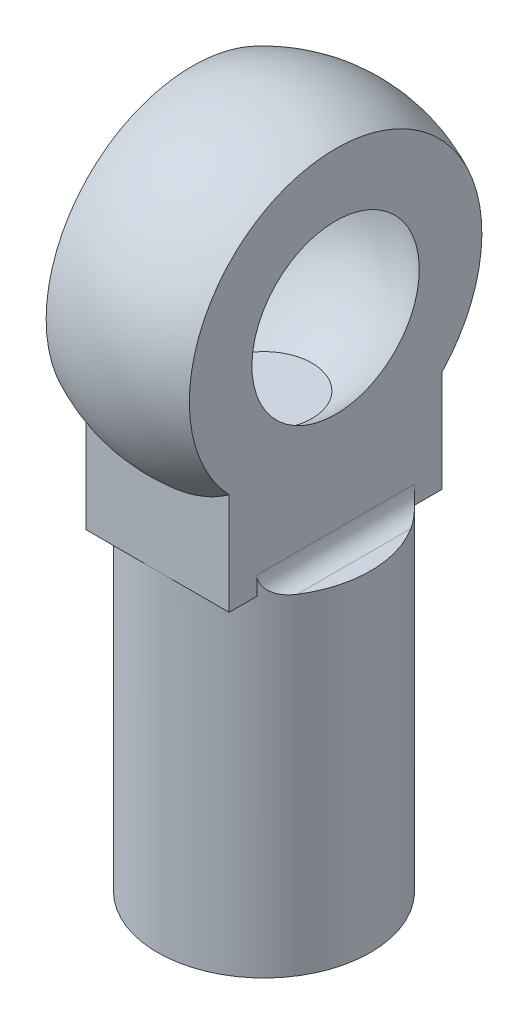
ISO-10303-21;
HEADER;
FILE_DESCRIPTION(('STEP AP214'),'2;1');
FILE_NAME('part.step','',(''),(''),'','','');
FILE_SCHEMA(('AUTOMOTIVE_DESIGN { 1 0 10303 214 1 1 1 1 }'));
ENDSEC;
DATA;
#1=APPLICATION_CONTEXT('core data for automotive mechanical design processes');
#2=APPLICATION_PROTOCOL_DEFINITION('international standard','automotive_design',2000,#1);
#3=PRODUCT_CONTEXT('',#1,'mechanical');
#4=PRODUCT('Part','Part','',(#3));
#5=PRODUCT_RELATED_PRODUCT_CATEGORY('part','',(#4));
#6=PRODUCT_DEFINITION_FORMATION('','',#4);
#7=PRODUCT_DEFINITION_CONTEXT('part definition',#1,'design');
#8=PRODUCT_DEFINITION('design','',#6,#7);
#9=PRODUCT_DEFINITION_SHAPE('','',#8);
#10=(LENGTH_UNIT() NAMED_UNIT(*) SI_UNIT(.MILLI.,.METRE.));
#11=(NAMED_UNIT(*) PLANE_ANGLE_UNIT() SI_UNIT($,.RADIAN.));
#12=(NAMED_UNIT(*) SI_UNIT($,.STERADIAN.) SOLID_ANGLE_UNIT());
#13=UNCERTAINTY_MEASURE_WITH_UNIT(LENGTH_MEASURE(1.E-05),#10,'distance_accuracy_value','');
#14=(GEOMETRIC_REPRESENTATION_CONTEXT(3) GLOBAL_UNCERTAINTY_ASSIGNED_CONTEXT((#13)) GLOBAL_UNIT_ASSIGNED_CONTEXT((#10,
#11,#12)) REPRESENTATION_CONTEXT('',''));
#15=CARTESIAN_POINT('',(0.,0.,0.));
#16=DIRECTION('',(0.,0.,1.));
#17=DIRECTION('',(1.,0.,0.));
#18=AXIS2_PLACEMENT_3D('',#15,#16,#17);
#19=CARTESIAN_POINT('',(-8.39049687524185,-5.5,-2.9));
#20=DIRECTION('',(0.,1.,0.));
#21=DIRECTION('',(-1.,0.,0.));
#22=AXIS2_PLACEMENT_3D('',#19,#20,#21);
#23=PLANE('',#22);
#24=CARTESIAN_POINT('',(0.,-5.5,0.));
#25=DIRECTION('',(0.,-1.,0.));
#26=DIRECTION('',(1.,0.,0.));
#27=AXIS2_PLACEMENT_3D('',#24,#25,#26);
#28=CIRCLE('',#27,2.9);
#29=CARTESIAN_POINT('',(1.95,-5.5,2.14650879336657));
#30=VERTEX_POINT('',#29);
#31=CARTESIAN_POINT('',(0.,-5.5,2.9));
#32=VERTEX_POINT('',#31);
#33=EDGE_CURVE('E148',#30,#32,#28,.T.);
#34=ORIENTED_EDGE('',*,*,#33,.F.);
#35=DIRECTION('',(0.,0.,-1.));
#36=VECTOR('',#35,1.);
#37=CARTESIAN_POINT('',(1.95,-5.5,-2.9));
#38=LINE('',#37,#36);
#39=CARTESIAN_POINT('',(1.95,-5.5,2.9));
#40=VERTEX_POINT('',#39);
#41=EDGE_CURVE('E140',#40,#30,#38,.T.);
#42=ORIENTED_EDGE('',*,*,#41,.F.);
#43=DIRECTION('',(1.,0.,0.));
#44=VECTOR('',#43,1.);
#45=CARTESIAN_POINT('',(-8.39049687524185,-5.5,2.9));
#46=LINE('',#45,#44);
#47=EDGE_CURVE('E306',#32,#40,#46,.T.);
#48=ORIENTED_EDGE('',*,*,#47,.F.);
#49=EDGE_LOOP('',(#34,#42,#48));
#50=FACE_BOUND('',#49,.T.);
#51=ADVANCED_FACE('F35',(#50),#23,.F.);
#52=CARTESIAN_POINT('',(-1.95,-5.5,2.14650879336657));
#53=VERTEX_POINT('',#52);
#54=EDGE_CURVE('E149',#32,#53,#28,.T.);
#55=ORIENTED_EDGE('',*,*,#54,.F.);
#56=CARTESIAN_POINT('',(-1.95,-5.5,2.9));
#57=VERTEX_POINT('',#56);
#58=EDGE_CURVE('E229',#57,#32,#46,.T.);
#59=ORIENTED_EDGE('',*,*,#58,.F.);
#60=DIRECTION('',(0.,0.,-1.));
#61=VECTOR('',#60,1.);
#62=CARTESIAN_POINT('',(-1.95,-5.5,-2.9));
#63=LINE('',#62,#61);
#64=EDGE_CURVE('E315',#57,#53,#63,.T.);
#65=ORIENTED_EDGE('',*,*,#64,.T.);
#66=EDGE_LOOP('',(#55,#59,#65));
#67=FACE_BOUND('',#66,.T.);
#68=ADVANCED_FACE('F194',(#67),#23,.F.);
#69=CARTESIAN_POINT('',(-1.95,-5.5,-2.14650879336657));
#70=VERTEX_POINT('',#69);
#71=CARTESIAN_POINT('',(0.,-5.5,-2.9));
#72=VERTEX_POINT('',#71);
#73=EDGE_CURVE('E145',#70,#72,#28,.T.);
#74=ORIENTED_EDGE('',*,*,#73,.F.);
#75=CARTESIAN_POINT('',(-1.95,-5.5,-2.9));
#76=VERTEX_POINT('',#75);
#77=EDGE_CURVE('E221',#70,#76,#63,.T.);
#78=ORIENTED_EDGE('',*,*,#77,.T.);
#79=DIRECTION('',(1.,0.,0.));
#80=VECTOR('',#79,1.);
#81=CARTESIAN_POINT('',(-8.39049687524185,-5.5,-2.9));
#82=LINE('',#81,#80);
#83=EDGE_CURVE('E224',#76,#72,#82,.T.);
#84=ORIENTED_EDGE('',*,*,#83,.T.);
#85=EDGE_LOOP('',(#74,#78,#84));
#86=FACE_BOUND('',#85,.T.);
#87=ADVANCED_FACE('F200',(#86),#23,.F.);
#88=CARTESIAN_POINT('',(0.,0.,0.));
#89=DIRECTION('',(0.,1.,0.));
#90=DIRECTION('',(1.,0.,0.));
#91=AXIS2_PLACEMENT_3D('',#88,#89,#90);
#92=SPHERICAL_SURFACE('',#91,4.435);
#93=CARTESIAN_POINT('',(0.,0.,2.9));
#94=DIRECTION('',(0.,0.,-1.));
#95=DIRECTION('',(0.,1.,0.));
#96=AXIS2_PLACEMENT_3D('',#93,#94,#95);
#97=CIRCLE('',#96,3.3554768662591);
#98=CARTESIAN_POINT('',(1.95,-2.73070045958908,2.9));
#99=VERTEX_POINT('',#98);
#100=CARTESIAN_POINT('',(-1.95,-2.73070045958908,2.9));
#101=VERTEX_POINT('',#100);
#102=EDGE_CURVE('E235',#99,#101,#97,.T.);
#103=ORIENTED_EDGE('',*,*,#102,.F.);
#104=CARTESIAN_POINT('',(1.95,0.,0.));
#105=DIRECTION('',(-1.,0.,0.));
#106=DIRECTION('',(0.,-1.,0.));
#107=AXIS2_PLACEMENT_3D('',#104,#105,#106);
#108=CIRCLE('',#107,3.98330578791034);
#109=CARTESIAN_POINT('',(1.95,-2.73070045958908,-2.9));
#110=VERTEX_POINT('',#109);
#111=EDGE_CURVE('E243',#99,#110,#108,.T.);
#112=ORIENTED_EDGE('',*,*,#111,.T.);
#113=CARTESIAN_POINT('',(0.,0.,-2.9));
#114=DIRECTION('',(0.,0.,1.));
#115=DIRECTION('',(0.,-1.,0.));
#116=AXIS2_PLACEMENT_3D('',#113,#114,#115);
#117=CIRCLE('',#116,3.3554768662591);
#118=CARTESIAN_POINT('',(-1.95,-2.73070045958908,-2.9));
#119=VERTEX_POINT('',#118);
#120=EDGE_CURVE('E233',#119,#110,#117,.T.);
#121=ORIENTED_EDGE('',*,*,#120,.F.);
#122=CARTESIAN_POINT('',(-1.95,0.,0.));
#123=DIRECTION('',(1.,0.,0.));
#124=DIRECTION('',(0.,1.,0.));
#125=AXIS2_PLACEMENT_3D('',#122,#123,#124);
#126=CIRCLE('',#125,3.98330578791034);
#127=EDGE_CURVE('E151',#119,#101,#126,.T.);
#128=ORIENTED_EDGE('',*,*,#127,.T.);
#129=EDGE_LOOP('',(#103,#112,#121,#128));
#130=FACE_BOUND('',#129,.T.);
#131=ADVANCED_FACE('F212',(#130),#92,.T.);
#132=CARTESIAN_POINT('',(0.,0.,0.));
#133=DIRECTION('',(0.,1.,0.));
#134=DIRECTION('',(0.,0.,1.));
#135=AXIS2_PLACEMENT_3D('',#132,#133,#134);
#136=SPHERICAL_SURFACE('',#135,3.);
#137=CARTESIAN_POINT('',(0.,-2.7,0.));
#138=DIRECTION('',(0.,-1.,0.));
#139=DIRECTION('',(1.,0.,0.));
#140=AXIS2_PLACEMENT_3D('',#137,#138,#139);
#141=CIRCLE('',#140,1.3076696830622);
#142=CARTESIAN_POINT('',(1.3076696830622,-2.7,0.));
#143=VERTEX_POINT('',#142);
#144=EDGE_CURVE('E146',#143,#143,#141,.T.);
#145=ORIENTED_EDGE('',*,*,#144,.T.);
#146=EDGE_LOOP('',(#145));
#147=FACE_BOUND('',#146,.T.);
#148=CARTESIAN_POINT('',(-1.95,0.,0.));
#149=DIRECTION('',(1.,0.,0.));
#150=DIRECTION('',(0.,1.,0.));
#151=AXIS2_PLACEMENT_3D('',#148,#149,#150);
#152=CIRCLE('',#151,2.2798026230356);
#153=CARTESIAN_POINT('',(-1.95,2.2798026230356,0.));
#154=VERTEX_POINT('',#153);
#155=EDGE_CURVE('E239',#154,#154,#152,.F.);
#156=ORIENTED_EDGE('',*,*,#155,.T.);
#157=EDGE_LOOP('',(#156));
#158=FACE_BOUND('',#157,.T.);
#159=CARTESIAN_POINT('',(1.95,0.,0.));
#160=DIRECTION('',(-1.,0.,0.));
#161=DIRECTION('',(0.,-1.,0.));
#162=AXIS2_PLACEMENT_3D('',#159,#160,#161);
#163=CIRCLE('',#162,2.2798026230356);
#164=CARTESIAN_POINT('',(1.95,-2.2798026230356,0.));
#165=VERTEX_POINT('',#164);
#166=EDGE_CURVE('E240',#165,#165,#163,.F.);
#167=ORIENTED_EDGE('',*,*,#166,.T.);
#168=EDGE_LOOP('',(#167));
#169=FACE_BOUND('',#168,.T.);
#170=ADVANCED_FACE('F217',(#147,#158,#169),#136,.F.);
#171=CARTESIAN_POINT('',(1.95,4.93146209986908,-10.));
#172=DIRECTION('',(-1.,0.,0.));
#173=DIRECTION('',(0.,-1.,0.));
#174=AXIS2_PLACEMENT_3D('',#171,#172,#173);
#175=PLANE('',#174);
#176=ORIENTED_EDGE('',*,*,#166,.F.);
#177=EDGE_LOOP('',(#176));
#178=FACE_BOUND('',#177,.T.);
#179=DIRECTION('',(0.,0.,-1.));
#180=VECTOR('',#179,1.);
#181=CARTESIAN_POINT('',(1.95,-5.,-2.14650879336657));
#182=LINE('',#181,#180);
#183=CARTESIAN_POINT('',(1.95,-5.,2.14650879336657));
#184=VERTEX_POINT('',#183);
#185=CARTESIAN_POINT('',(1.95,-5.,-2.14650879336657));
#186=VERTEX_POINT('',#185);
#187=EDGE_CURVE('E130',#184,#186,#182,.T.);
#188=ORIENTED_EDGE('',*,*,#187,.T.);
#189=DIRECTION('',(0.,1.,0.));
#190=VECTOR('',#189,1.);
#191=CARTESIAN_POINT('',(1.95,-5.,-2.14650879336657));
#192=LINE('',#191,#190);
#193=CARTESIAN_POINT('',(1.95,-5.5,-2.14650879336657));
#194=VERTEX_POINT('',#193);
#195=EDGE_CURVE('E123',#186,#194,#192,.F.);
#196=ORIENTED_EDGE('',*,*,#195,.T.);
#197=CARTESIAN_POINT('',(1.95,-5.5,-2.9));
#198=VERTEX_POINT('',#197);
#199=EDGE_CURVE('E127',#194,#198,#38,.T.);
#200=ORIENTED_EDGE('',*,*,#199,.T.);
#201=DIRECTION('',(0.,1.,0.));
#202=VECTOR('',#201,1.);
#203=CARTESIAN_POINT('',(1.95,-2.7,-2.9));
#204=LINE('',#203,#202);
#205=EDGE_CURVE('E160',#198,#110,#204,.T.);
#206=ORIENTED_EDGE('',*,*,#205,.T.);
#207=ORIENTED_EDGE('',*,*,#111,.F.);
#208=DIRECTION('',(0.,-1.,0.));
#209=VECTOR('',#208,1.);
#210=CARTESIAN_POINT('',(1.95,-2.7,2.9));
#211=LINE('',#210,#209);
#212=EDGE_CURVE('E141',#99,#40,#211,.T.);
#213=ORIENTED_EDGE('',*,*,#212,.T.);
#214=ORIENTED_EDGE('',*,*,#41,.T.);
#215=DIRECTION('',(0.,1.,0.));
#216=VECTOR('',#215,1.);
#217=CARTESIAN_POINT('',(1.95,-5.5,2.14650879336657));
#218=LINE('',#217,#216);
#219=EDGE_CURVE('E54',#30,#184,#218,.T.);
#220=ORIENTED_EDGE('',*,*,#219,.T.);
#221=EDGE_LOOP('',(#188,#196,#200,#206,#207,#213,#214,#220));
#222=FACE_BOUND('',#221,.T.);
#223=ADVANCED_FACE('F125',(#178,#222),#175,.F.);
#224=CARTESIAN_POINT('',(-1.95,4.93146209986908,-10.));
#225=DIRECTION('',(1.,0.,0.));
#226=DIRECTION('',(0.,1.,0.));
#227=AXIS2_PLACEMENT_3D('',#224,#225,#226);
#228=PLANE('',#227);
#229=ORIENTED_EDGE('',*,*,#77,.F.);
#230=DIRECTION('',(0.,1.,0.));
#231=VECTOR('',#230,1.);
#232=CARTESIAN_POINT('',(-1.95,-5.5,-2.14650879336657));
#233=LINE('',#232,#231);
#234=CARTESIAN_POINT('',(-1.95,-5.,-2.14650879336657));
#235=VERTEX_POINT('',#234);
#236=EDGE_CURVE('E61',#70,#235,#233,.T.);
#237=ORIENTED_EDGE('',*,*,#236,.T.);
#238=DIRECTION('',(0.,0.,-1.));
#239=VECTOR('',#238,1.);
#240=CARTESIAN_POINT('',(-1.95,-5.,2.14650879336657));
#241=LINE('',#240,#239);
#242=CARTESIAN_POINT('',(-1.95,-5.,2.14650879336657));
#243=VERTEX_POINT('',#242);
#244=EDGE_CURVE('E254',#235,#243,#241,.F.);
#245=ORIENTED_EDGE('',*,*,#244,.T.);
#246=DIRECTION('',(0.,1.,0.));
#247=VECTOR('',#246,1.);
#248=CARTESIAN_POINT('',(-1.95,-5.,2.14650879336657));
#249=LINE('',#248,#247);
#250=EDGE_CURVE('E252',#243,#53,#249,.F.);
#251=ORIENTED_EDGE('',*,*,#250,.T.);
#252=ORIENTED_EDGE('',*,*,#64,.F.);
#253=DIRECTION('',(0.,-1.,0.));
#254=VECTOR('',#253,1.);
#255=CARTESIAN_POINT('',(-1.95,-2.7,2.9));
#256=LINE('',#255,#254);
#257=EDGE_CURVE('E226',#101,#57,#256,.T.);
#258=ORIENTED_EDGE('',*,*,#257,.F.);
#259=ORIENTED_EDGE('',*,*,#127,.F.);
#260=DIRECTION('',(0.,1.,0.));
#261=VECTOR('',#260,1.);
#262=CARTESIAN_POINT('',(-1.95,-2.7,-2.9));
#263=LINE('',#262,#261);
#264=EDGE_CURVE('E236',#76,#119,#263,.T.);
#265=ORIENTED_EDGE('',*,*,#264,.F.);
#266=EDGE_LOOP('',(#229,#237,#245,#251,#252,#258,#259,#265));
#267=FACE_BOUND('',#266,.T.);
#268=ORIENTED_EDGE('',*,*,#155,.F.);
#269=EDGE_LOOP('',(#268));
#270=FACE_BOUND('',#269,.T.);
#271=ADVANCED_FACE('F278',(#267,#270),#228,.F.);
#272=CARTESIAN_POINT('',(-8.39049687524185,-2.7,-2.9));
#273=DIRECTION('',(0.,-1.,0.));
#274=DIRECTION('',(1.,0.,0.));
#275=AXIS2_PLACEMENT_3D('',#272,#273,#274);
#276=PLANE('',#275);
#277=ORIENTED_EDGE('',*,*,#144,.F.);
#278=EDGE_LOOP('',(#277));
#279=FACE_BOUND('',#278,.T.);
#280=ADVANCED_FACE('F282',(#279),#276,.F.);
#281=CARTESIAN_POINT('',(-8.39049687524185,-2.7,2.9));
#282=DIRECTION('',(0.,0.,-1.));
#283=DIRECTION('',(0.,1.,0.));
#284=AXIS2_PLACEMENT_3D('',#281,#282,#283);
#285=PLANE('',#284);
#286=ORIENTED_EDGE('',*,*,#58,.T.);
#287=ORIENTED_EDGE('',*,*,#47,.T.);
#288=ORIENTED_EDGE('',*,*,#212,.F.);
#289=ORIENTED_EDGE('',*,*,#102,.T.);
#290=ORIENTED_EDGE('',*,*,#257,.T.);
#291=EDGE_LOOP('',(#286,#287,#288,#289,#290));
#292=FACE_BOUND('',#291,.T.);
#293=ADVANCED_FACE('F209',(#292),#285,.F.);
#294=CARTESIAN_POINT('',(-8.39049687524185,-2.7,-2.9));
#295=DIRECTION('',(0.,0.,1.));
#296=DIRECTION('',(0.,-1.,0.));
#297=AXIS2_PLACEMENT_3D('',#294,#295,#296);
#298=PLANE('',#297);
#299=ORIENTED_EDGE('',*,*,#264,.T.);
#300=ORIENTED_EDGE('',*,*,#120,.T.);
#301=ORIENTED_EDGE('',*,*,#205,.F.);
#302=EDGE_CURVE('E138',#72,#198,#82,.T.);
#303=ORIENTED_EDGE('',*,*,#302,.F.);
#304=ORIENTED_EDGE('',*,*,#83,.F.);
#305=EDGE_LOOP('',(#299,#300,#301,#303,#304));
#306=FACE_BOUND('',#305,.T.);
#307=ADVANCED_FACE('F205',(#306),#298,.F.);
#308=EDGE_CURVE('E136',#72,#194,#28,.T.);
#309=ORIENTED_EDGE('',*,*,#308,.F.);
#310=ORIENTED_EDGE('',*,*,#302,.T.);
#311=ORIENTED_EDGE('',*,*,#199,.F.);
#312=EDGE_LOOP('',(#309,#310,#311));
#313=FACE_BOUND('',#312,.T.);
#314=ADVANCED_FACE('F135',(#313),#23,.F.);
#315=CARTESIAN_POINT('',(0.,-5.5,0.));
#316=DIRECTION('',(0.,-1.,0.));
#317=DIRECTION('',(1.,0.,0.));
#318=AXIS2_PLACEMENT_3D('',#315,#316,#317);
#319=PLANE('',#318);
#320=CARTESIAN_POINT('',(-2.45,-5.5,1.55161206491829));
#321=VERTEX_POINT('',#320);
#322=CARTESIAN_POINT('',(-2.45,-5.5,-1.55161206491829));
#323=VERTEX_POINT('',#322);
#324=EDGE_CURVE('E155',#321,#323,#28,.T.);
#325=ORIENTED_EDGE('',*,*,#324,.F.);
#326=DIRECTION('',(0.,0.,-1.));
#327=VECTOR('',#326,1.);
#328=CARTESIAN_POINT('',(-2.45,-5.5,-2.14650879336657));
#329=LINE('',#328,#327);
#330=EDGE_CURVE('E249',#321,#323,#329,.T.);
#331=ORIENTED_EDGE('',*,*,#330,.T.);
#332=EDGE_LOOP('',(#325,#331));
#333=FACE_BOUND('',#332,.T.);
#334=ADVANCED_FACE('F185',(#333),#319,.F.);
#335=CARTESIAN_POINT('',(0.,-14.5,0.));
#336=DIRECTION('',(0.,1.,0.));
#337=DIRECTION('',(-1.,0.,0.));
#338=AXIS2_PLACEMENT_3D('',#335,#336,#337);
#339=CYLINDRICAL_SURFACE('',#338,2.9);
#340=CARTESIAN_POINT('',(0.,-14.5,0.));
#341=DIRECTION('',(0.,-1.,0.));
#342=DIRECTION('',(1.,0.,0.));
#343=AXIS2_PLACEMENT_3D('',#340,#341,#342);
#344=CIRCLE('',#343,2.9);
#345=CARTESIAN_POINT('',(2.9,-14.5,0.));
#346=VERTEX_POINT('',#345);
#347=EDGE_CURVE('E154',#346,#346,#344,.T.);
#348=ORIENTED_EDGE('',*,*,#347,.F.);
#349=EDGE_LOOP('',(#348));
#350=FACE_BOUND('',#349,.T.);
#351=ORIENTED_EDGE('',*,*,#33,.T.);
#352=ORIENTED_EDGE('',*,*,#54,.T.);
#353=ORIENTED_EDGE('',*,*,#250,.F.);
#354=CARTESIAN_POINT('',(-1.95,-5.,2.14650879336657));
#355=CARTESIAN_POINT('',(-1.9499630733076,-5.02259467327779,2.14653156681716));
#356=CARTESIAN_POINT('',(-1.95152914355843,-5.045151864953,2.14511977108671));
#357=CARTESIAN_POINT('',(-1.95756358703335,-5.08939528606316,2.13961987911653));
#358=CARTESIAN_POINT('',(-1.96201314601956,-5.11108620056769,2.13554913070015));
#359=CARTESIAN_POINT('',(-1.97350870364117,-5.15307641665474,2.12492828207469));
#360=CARTESIAN_POINT('',(-1.9805505728437,-5.17337787091964,2.11838212463126));
#361=CARTESIAN_POINT('',(-1.99678721381584,-5.21223131206217,2.10308493726663));
#362=CARTESIAN_POINT('',(-2.00598540868035,-5.23078045081986,2.09433039991818));
#363=CARTESIAN_POINT('',(-2.02914976995624,-5.27126283971803,2.07192705136278));
#364=CARTESIAN_POINT('',(-2.04371203724776,-5.29248003458538,2.05760121484415));
#365=CARTESIAN_POINT('',(-2.07469439583508,-5.33130799082402,2.02635868422214));
#366=CARTESIAN_POINT('',(-2.09111631585272,-5.34891515355339,2.00943943395861));
#367=CARTESIAN_POINT('',(-2.13152413748615,-5.38679127706544,1.96666337637772));
#368=CARTESIAN_POINT('',(-2.1559911507112,-5.40548190099434,1.9398709569554));
#369=CARTESIAN_POINT('',(-2.20549670692852,-5.43713587566309,1.88340300317103));
#370=CARTESIAN_POINT('',(-2.23053753080607,-5.45006948573006,1.85371344175795));
#371=CARTESIAN_POINT('',(-2.27255872010487,-5.46782810429502,1.80172995039566));
#372=CARTESIAN_POINT('',(-2.28966320958601,-5.47392322952725,1.77994948821328));
#373=CARTESIAN_POINT('',(-2.32347249099527,-5.48404799868235,1.73558446946255));
#374=CARTESIAN_POINT('',(-2.34017693235345,-5.48807588995532,1.71299924788991));
#375=CARTESIAN_POINT('',(-2.37277859668743,-5.49427558429553,1.66754070437249));
#376=CARTESIAN_POINT('',(-2.38868422795397,-5.49647465752303,1.64467697302312));
#377=CARTESIAN_POINT('',(-2.41984207055571,-5.4993328392813,1.59848118328864));
#378=CARTESIAN_POINT('',(-2.43509557038435,-5.49999513671745,1.57515019620909));
#379=CARTESIAN_POINT('',(-2.45,-5.5,1.55161206491829));
#380=B_SPLINE_CURVE_WITH_KNOTS('',3,(#354,#355,#356,#357,#358,#359,#360,#361,#362,#363,#364,
#365,#366,#367,#368,#369,#370,#371,#372,#373,#374,#375,#376,#377,#378,#379),.UNSPECIFIED.,.F.,
.F.,(4,2,2,2,2,2,2,2,2,2,2,2,4),(0.,0.0676265288843729,0.134816190252032,0.201899281425183,
0.2690895946405,0.356963793527052,0.444925167973643,0.566697588403768,0.689091983097637,
0.77407326908436,0.859126485689008,0.942887471151394,1.02647449132076),.UNSPECIFIED.);
#381=EDGE_CURVE('E266',#243,#321,#380,.T.);
#382=ORIENTED_EDGE('',*,*,#381,.T.);
#383=ORIENTED_EDGE('',*,*,#324,.T.);
#384=CARTESIAN_POINT('',(-2.45,-5.5,-1.55161206491829));
#385=CARTESIAN_POINT('',(-2.43109827969777,-5.49998720950668,-1.58147016699958));
#386=CARTESIAN_POINT('',(-2.41162115568972,-5.49892571366404,-1.61100539375606));
#387=CARTESIAN_POINT('',(-2.37159438686852,-5.49423159904052,-1.66936790842173));
#388=CARTESIAN_POINT('',(-2.35103933817813,-5.49058458960297,-1.6981902952322));
#389=CARTESIAN_POINT('',(-2.30884477069904,-5.48015967566636,-1.75513859139351));
#390=CARTESIAN_POINT('',(-2.28719378195332,-5.47333672360465,-1.78324813042937));
#391=CARTESIAN_POINT('',(-2.2435133168672,-5.45597633272691,-1.83789715889516));
#392=CARTESIAN_POINT('',(-2.22148496970734,-5.44544858816923,-1.86444053681465));
#393=CARTESIAN_POINT('',(-2.17975265729543,-5.42129384059813,-1.91300811807021));
#394=CARTESIAN_POINT('',(-2.16003403354999,-5.40807571334618,-1.93521972783666));
#395=CARTESIAN_POINT('',(-2.12142397716433,-5.37767603865379,-1.97746698537817));
#396=CARTESIAN_POINT('',(-2.10253039951812,-5.3605055993462,-1.99750850439808));
#397=CARTESIAN_POINT('',(-2.06618375176548,-5.32156561959926,-2.03508649679148));
#398=CARTESIAN_POINT('',(-2.04875454097641,-5.29973508000559,-2.05258398840366));
#399=CARTESIAN_POINT('',(-2.01695575937618,-5.25159125007697,-2.08383955710555));
#400=CARTESIAN_POINT('',(-2.00257973887356,-5.225287625028,-2.09760553416722));
#401=CARTESIAN_POINT('',(-1.9823034153125,-5.17802184558944,-2.11674303916934));
#402=CARTESIAN_POINT('',(-1.97516664066251,-5.15809753517643,-2.12338894168487));
#403=CARTESIAN_POINT('',(-1.96339174646736,-5.11691161779191,-2.13428152986358));
#404=CARTESIAN_POINT('',(-1.95874899035302,-5.09565257497958,-2.13853266829565));
#405=CARTESIAN_POINT('',(-1.95368651045323,-5.06184844828812,-2.14315536626098));
#406=CARTESIAN_POINT('',(-1.95230793987568,-5.04955543085579,-2.14441047024513));
#407=CARTESIAN_POINT('',(-1.95046354590737,-5.02484410209542,-2.14608772258716));
#408=CARTESIAN_POINT('',(-1.9499977867897,-5.01242578200642,-2.14650981229068));
#409=CARTESIAN_POINT('',(-1.95,-5.,-2.14650879336657));
#410=B_SPLINE_CURVE_WITH_KNOTS('',3,(#384,#385,#386,#387,#388,#389,#390,#391,#392,#393,#394,
#395,#396,#397,#398,#399,#400,#401,#402,#403,#404,#405,#406,#407,#408,#409),.UNSPECIFIED.,.F.,
.F.,(4,2,2,2,2,2,2,2,2,2,2,2,4),(0.,0.106046134976273,0.212687191442042,0.320889223344771,
0.428810204956424,0.526070613104403,0.623060934390486,0.72140858192166,0.819546362438193,
0.885826949461074,0.95198388563316,0.989228575515209,1.02647588778423),.UNSPECIFIED.);
#411=EDGE_CURVE('E261',#323,#235,#410,.T.);
#412=ORIENTED_EDGE('',*,*,#411,.T.);
#413=ORIENTED_EDGE('',*,*,#236,.F.);
#414=ORIENTED_EDGE('',*,*,#73,.T.);
#415=ORIENTED_EDGE('',*,*,#308,.T.);
#416=ORIENTED_EDGE('',*,*,#195,.F.);
#417=CARTESIAN_POINT('',(1.95,-5.,-2.14650879336657));
#418=CARTESIAN_POINT('',(1.9499630733076,-5.02259467327779,-2.14653156681715));
#419=CARTESIAN_POINT('',(1.95152914355844,-5.045151864953,-2.14511977108671));
#420=CARTESIAN_POINT('',(1.95756358703335,-5.08939528606316,-2.13961987911652));
#421=CARTESIAN_POINT('',(1.96201314601956,-5.11108620056769,-2.13554913070015));
#422=CARTESIAN_POINT('',(1.97350870364117,-5.15307641665474,-2.12492828207469));
#423=CARTESIAN_POINT('',(1.98055057284371,-5.17337787091964,-2.11838212463126));
#424=CARTESIAN_POINT('',(1.99678721381584,-5.21223131206217,-2.10308493726663));
#425=CARTESIAN_POINT('',(2.00598540868036,-5.23078045081986,-2.09433039991818));
#426=CARTESIAN_POINT('',(2.02914976995624,-5.27126283971803,-2.07192705136278));
#427=CARTESIAN_POINT('',(2.04371203724776,-5.29248003458538,-2.05760121484414));
#428=CARTESIAN_POINT('',(2.07469439583508,-5.33130799082402,-2.02635868422214));
#429=CARTESIAN_POINT('',(2.09111631585272,-5.34891515355339,-2.00943943395861));
#430=CARTESIAN_POINT('',(2.13152413748615,-5.38679127706544,-1.96666337637772));
#431=CARTESIAN_POINT('',(2.1559911507112,-5.40548190099435,-1.9398709569554));
#432=CARTESIAN_POINT('',(2.20549670692852,-5.4371358756631,-1.88340300317103));
#433=CARTESIAN_POINT('',(2.23053753080608,-5.45006948573006,-1.85371344175795));
#434=CARTESIAN_POINT('',(2.27255872010487,-5.46782810429502,-1.80172995039566));
#435=CARTESIAN_POINT('',(2.28966320958602,-5.47392322952725,-1.77994948821328));
#436=CARTESIAN_POINT('',(2.32347249099528,-5.48404799868235,-1.73558446946255));
#437=CARTESIAN_POINT('',(2.34017693235345,-5.48807588995532,-1.7129992478899));
#438=CARTESIAN_POINT('',(2.37277859668743,-5.49427558429553,-1.66754070437249));
#439=CARTESIAN_POINT('',(2.38868422795397,-5.49647465752303,-1.64467697302312));
#440=CARTESIAN_POINT('',(2.41984207055571,-5.4993328392813,-1.59848118328863));
#441=CARTESIAN_POINT('',(2.43509557038436,-5.49999513671745,-1.57515019620908));
#442=CARTESIAN_POINT('',(2.45,-5.5,-1.55161206491829));
#443=B_SPLINE_CURVE_WITH_KNOTS('',3,(#417,#418,#419,#420,#421,#422,#423,#424,#425,#426,#427,
#428,#429,#430,#431,#432,#433,#434,#435,#436,#437,#438,#439,#440,#441,#442),.UNSPECIFIED.,.F.,
.F.,(4,2,2,2,2,2,2,2,2,2,2,2,4),(0.,0.0676265288843729,0.134816190252032,0.201899281425183,
0.2690895946405,0.356963793527051,0.444925167973643,0.566697588403768,0.689091983097638,
0.77407326908436,0.859126485689008,0.942887471151393,1.02647449132075),.UNSPECIFIED.);
#444=CARTESIAN_POINT('',(2.45,-5.5,-1.55161206491829));
#445=VERTEX_POINT('',#444);
#446=EDGE_CURVE('E48',#186,#445,#443,.T.);
#447=ORIENTED_EDGE('',*,*,#446,.T.);
#448=CARTESIAN_POINT('',(2.45,-5.5,1.55161206491829));
#449=VERTEX_POINT('',#448);
#450=EDGE_CURVE('E156',#445,#449,#28,.T.);
#451=ORIENTED_EDGE('',*,*,#450,.T.);
#452=CARTESIAN_POINT('',(2.45,-5.5,1.55161206491829));
#453=CARTESIAN_POINT('',(2.43109827969777,-5.49998720950668,1.58147016699958));
#454=CARTESIAN_POINT('',(2.41162115568972,-5.49892571366404,1.61100539375606));
#455=CARTESIAN_POINT('',(2.37159438686852,-5.49423159904052,1.66936790842173));
#456=CARTESIAN_POINT('',(2.35103933817813,-5.49058458960297,1.6981902952322));
#457=CARTESIAN_POINT('',(2.30884477069905,-5.48015967566636,1.75513859139351));
#458=CARTESIAN_POINT('',(2.28719378195332,-5.47333672360465,1.78324813042937));
#459=CARTESIAN_POINT('',(2.24351331686721,-5.45597633272691,1.83789715889515));
#460=CARTESIAN_POINT('',(2.22148496970734,-5.44544858816923,1.86444053681465));
#461=CARTESIAN_POINT('',(2.17975265729543,-5.42129384059813,1.91300811807021));
#462=CARTESIAN_POINT('',(2.16003403355,-5.40807571334619,1.93521972783666));
#463=CARTESIAN_POINT('',(2.12142397716433,-5.3776760386538,1.97746698537817));
#464=CARTESIAN_POINT('',(2.10253039951813,-5.3605055993462,1.99750850439808));
#465=CARTESIAN_POINT('',(2.06618375176549,-5.32156561959926,2.03508649679148));
#466=CARTESIAN_POINT('',(2.04875454097641,-5.29973508000559,2.05258398840366));
#467=CARTESIAN_POINT('',(2.01695575937619,-5.25159125007698,2.08383955710555));
#468=CARTESIAN_POINT('',(2.00257973887357,-5.225287625028,2.09760553416722));
#469=CARTESIAN_POINT('',(1.9823034153125,-5.17802184558944,2.11674303916933));
#470=CARTESIAN_POINT('',(1.97516664066251,-5.15809753517643,2.12338894168487));
#471=CARTESIAN_POINT('',(1.96339174646736,-5.11691161779191,2.13428152986358));
#472=CARTESIAN_POINT('',(1.95874899035302,-5.09565257497958,2.13853266829565));
#473=CARTESIAN_POINT('',(1.95368651045323,-5.06184844828812,2.14315536626098));
#474=CARTESIAN_POINT('',(1.95230793987568,-5.04955543085579,2.14441047024512));
#475=CARTESIAN_POINT('',(1.95046354590738,-5.02484410209542,2.14608772258716));
#476=CARTESIAN_POINT('',(1.9499977867897,-5.01242578200642,2.14650981229068));
#477=CARTESIAN_POINT('',(1.95,-5.,2.14650879336657));
#478=B_SPLINE_CURVE_WITH_KNOTS('',3,(#452,#453,#454,#455,#456,#457,#458,#459,#460,#461,#462,
#463,#464,#465,#466,#467,#468,#469,#470,#471,#472,#473,#474,#475,#476,#477),.UNSPECIFIED.,.F.,
.F.,(4,2,2,2,2,2,2,2,2,2,2,2,4),(0.,0.106046134976274,0.212687191442041,0.32088922334477,
0.428810204956423,0.5260706131044,0.623060934390485,0.721408581921659,0.819546362438193,
0.885826949461073,0.951983885633158,0.989228575515209,1.02647588778423),.UNSPECIFIED.);
#479=EDGE_CURVE('E11',#449,#184,#478,.T.);
#480=ORIENTED_EDGE('',*,*,#479,.T.);
#481=ORIENTED_EDGE('',*,*,#219,.F.);
#482=EDGE_LOOP('',(#351,#352,#353,#382,#383,#412,#413,#414,#415,#416,#447,#451,#480,#481));
#483=FACE_BOUND('',#482,.T.);
#484=ADVANCED_FACE('F143',(#350,#483),#339,.T.);
#485=CARTESIAN_POINT('',(0.,-14.5,0.));
#486=DIRECTION('',(0.,-1.,0.));
#487=DIRECTION('',(1.,0.,0.));
#488=AXIS2_PLACEMENT_3D('',#485,#486,#487);
#489=PLANE('',#488);
#490=CARTESIAN_POINT('',(0.,-14.5,0.));
#491=DIRECTION('',(0.,-1.,0.));
#492=DIRECTION('',(1.,0.,0.));
#493=AXIS2_PLACEMENT_3D('',#490,#491,#492);
#494=CIRCLE('',#493,1.5);
#495=CARTESIAN_POINT('',(1.5,-14.5,0.));
#496=VERTEX_POINT('',#495);
#497=EDGE_CURVE('E167',#496,#496,#494,.T.);
#498=ORIENTED_EDGE('',*,*,#497,.F.);
#499=EDGE_LOOP('',(#498));
#500=FACE_BOUND('',#499,.T.);
#501=ORIENTED_EDGE('',*,*,#347,.T.);
#502=EDGE_LOOP('',(#501));
#503=FACE_BOUND('',#502,.T.);
#504=ADVANCED_FACE('F177',(#500,#503),#489,.T.);
#505=ORIENTED_EDGE('',*,*,#450,.F.);
#506=DIRECTION('',(0.,0.,-1.));
#507=VECTOR('',#506,1.);
#508=CARTESIAN_POINT('',(2.45,-5.5,2.14650879336657));
#509=LINE('',#508,#507);
#510=EDGE_CURVE('E132',#445,#449,#509,.F.);
#511=ORIENTED_EDGE('',*,*,#510,.T.);
#512=EDGE_LOOP('',(#505,#511));
#513=FACE_BOUND('',#512,.T.);
#514=ADVANCED_FACE('F180',(#513),#319,.F.);
#515=CARTESIAN_POINT('',(-2.45,-5.,0.));
#516=DIRECTION('',(0.,0.,1.));
#517=DIRECTION('',(1.,0.,0.));
#518=AXIS2_PLACEMENT_3D('',#515,#516,#517);
#519=CYLINDRICAL_SURFACE('',#518,0.5);
#520=ORIENTED_EDGE('',*,*,#381,.F.);
#521=ORIENTED_EDGE('',*,*,#244,.F.);
#522=ORIENTED_EDGE('',*,*,#411,.F.);
#523=ORIENTED_EDGE('',*,*,#330,.F.);
#524=EDGE_LOOP('',(#520,#521,#522,#523));
#525=FACE_BOUND('',#524,.T.);
#526=ADVANCED_FACE('F270',(#525),#519,.F.);
#527=CARTESIAN_POINT('',(2.45,-5.,-10.));
#528=DIRECTION('',(0.,0.,1.));
#529=DIRECTION('',(1.,0.,0.));
#530=AXIS2_PLACEMENT_3D('',#527,#528,#529);
#531=CYLINDRICAL_SURFACE('',#530,0.5);
#532=ORIENTED_EDGE('',*,*,#479,.F.);
#533=ORIENTED_EDGE('',*,*,#510,.F.);
#534=ORIENTED_EDGE('',*,*,#446,.F.);
#535=ORIENTED_EDGE('',*,*,#187,.F.);
#536=EDGE_LOOP('',(#532,#533,#534,#535));
#537=FACE_BOUND('',#536,.T.);
#538=ADVANCED_FACE('F37',(#537),#531,.F.);
#539=CARTESIAN_POINT('',(0.,-6.5,0.));
#540=DIRECTION('',(0.,-1.,0.));
#541=DIRECTION('',(1.,0.,0.));
#542=AXIS2_PLACEMENT_3D('',#539,#540,#541);
#543=CYLINDRICAL_SURFACE('',#542,1.5);
#544=CARTESIAN_POINT('',(0.,-6.5,0.));
#545=DIRECTION('',(0.,-1.,0.));
#546=DIRECTION('',(1.,0.,0.));
#547=AXIS2_PLACEMENT_3D('',#544,#545,#546);
#548=CIRCLE('',#547,1.5);
#549=CARTESIAN_POINT('',(1.5,-6.5,0.));
#550=VERTEX_POINT('',#549);
#551=EDGE_CURVE('E163',#550,#550,#548,.T.);
#552=ORIENTED_EDGE('',*,*,#551,.F.);
#553=EDGE_LOOP('',(#552));
#554=FACE_BOUND('',#553,.T.);
#555=ORIENTED_EDGE('',*,*,#497,.T.);
#556=EDGE_LOOP('',(#555));
#557=FACE_BOUND('',#556,.T.);
#558=ADVANCED_FACE('F175',(#554,#557),#543,.F.);
#559=CARTESIAN_POINT('',(0.,-6.5,0.));
#560=DIRECTION('',(0.,-1.,0.));
#561=DIRECTION('',(1.,0.,0.));
#562=AXIS2_PLACEMENT_3D('',#559,#560,#561);
#563=PLANE('',#562);
#564=ORIENTED_EDGE('',*,*,#551,.T.);
#565=EDGE_LOOP('',(#564));
#566=FACE_BOUND('',#565,.T.);
#567=ADVANCED_FACE('F332',(#566),#563,.T.);
#568=CLOSED_SHELL('',(#51,#68,#87,#131,#170,#223,#271,#280,#293,#307,#314,#334,#484,#504,#514,
#526,#538,#558,#567));
#569=MANIFOLD_SOLID_BREP('B2',#568);
#570=ADVANCED_BREP_SHAPE_REPRESENTATION('',(#18,#569),#14);
#571=SHAPE_DEFINITION_REPRESENTATION(#9,#570);
ENDSEC;
END-ISO-10303-21;
